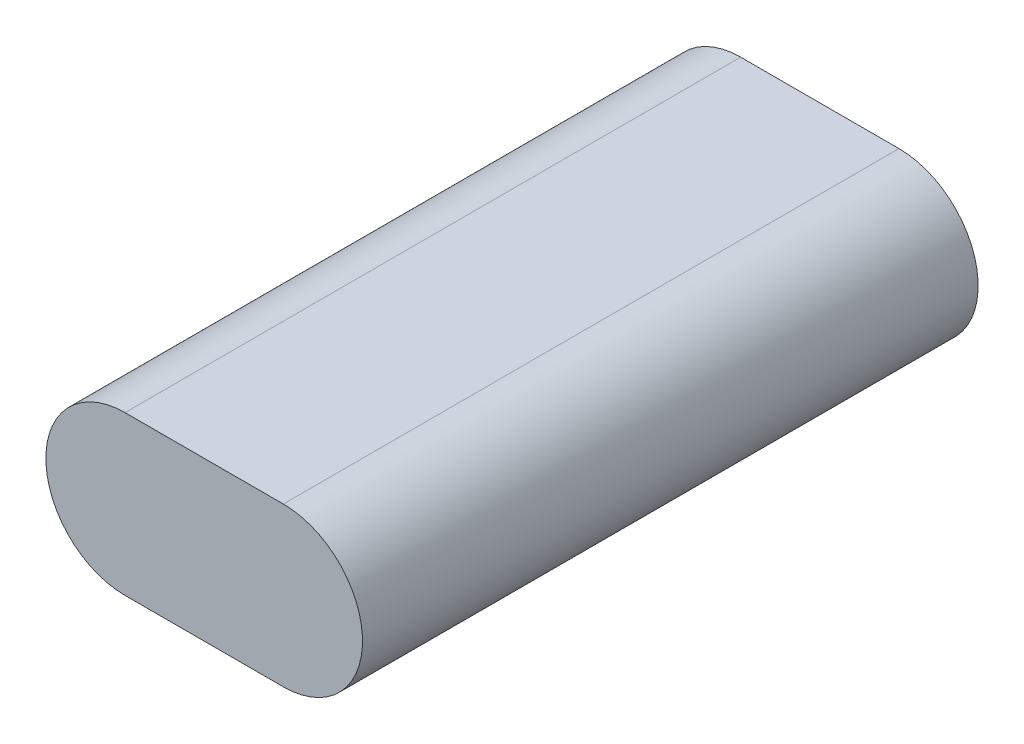
ISO-10303-21;
HEADER;
FILE_DESCRIPTION(('STEP AP214'),'2;1');
FILE_NAME('part.step','',(''),(''),'','','');
FILE_SCHEMA(('AUTOMOTIVE_DESIGN { 1 0 10303 214 1 1 1 1 }'));
ENDSEC;
DATA;
#1=APPLICATION_CONTEXT('core data for automotive mechanical design processes');
#2=APPLICATION_PROTOCOL_DEFINITION('international standard','automotive_design',2000,#1);
#3=PRODUCT_CONTEXT('',#1,'mechanical');
#4=PRODUCT('Part','Part','',(#3));
#5=PRODUCT_RELATED_PRODUCT_CATEGORY('part','',(#4));
#6=PRODUCT_DEFINITION_FORMATION('','',#4);
#7=PRODUCT_DEFINITION_CONTEXT('part definition',#1,'design');
#8=PRODUCT_DEFINITION('design','',#6,#7);
#9=PRODUCT_DEFINITION_SHAPE('','',#8);
#10=(LENGTH_UNIT() NAMED_UNIT(*) SI_UNIT(.MILLI.,.METRE.));
#11=(NAMED_UNIT(*) PLANE_ANGLE_UNIT() SI_UNIT($,.RADIAN.));
#12=(NAMED_UNIT(*) SI_UNIT($,.STERADIAN.) SOLID_ANGLE_UNIT());
#13=UNCERTAINTY_MEASURE_WITH_UNIT(LENGTH_MEASURE(1.E-05),#10,'distance_accuracy_value','');
#14=(GEOMETRIC_REPRESENTATION_CONTEXT(3) GLOBAL_UNCERTAINTY_ASSIGNED_CONTEXT((#13)) GLOBAL_UNIT_ASSIGNED_CONTEXT((#10,
#11,#12)) REPRESENTATION_CONTEXT('',''));
#15=CARTESIAN_POINT('',(0.,0.,0.));
#16=DIRECTION('',(0.,0.,1.));
#17=DIRECTION('',(1.,0.,0.));
#18=AXIS2_PLACEMENT_3D('',#15,#16,#17);
#19=CARTESIAN_POINT('',(-9.,0.,70.));
#20=DIRECTION('',(0.,0.,-1.));
#21=DIRECTION('',(-1.,0.,0.));
#22=AXIS2_PLACEMENT_3D('',#19,#20,#21);
#23=CYLINDRICAL_SURFACE('',#22,9.);
#24=CARTESIAN_POINT('',(-9.,0.,0.));
#25=DIRECTION('',(0.,0.,1.));
#26=DIRECTION('',(1.,0.,0.));
#27=AXIS2_PLACEMENT_3D('',#24,#25,#26);
#28=CIRCLE('',#27,9.);
#29=CARTESIAN_POINT('',(-9.,9.,0.));
#30=VERTEX_POINT('',#29);
#31=CARTESIAN_POINT('',(-9.,-9.,0.));
#32=VERTEX_POINT('',#31);
#33=EDGE_CURVE('E101',#30,#32,#28,.T.);
#34=ORIENTED_EDGE('',*,*,#33,.T.);
#35=DIRECTION('',(0.,0.,-1.));
#36=VECTOR('',#35,1.);
#37=CARTESIAN_POINT('',(-9.,-9.,70.));
#38=LINE('',#37,#36);
#39=CARTESIAN_POINT('',(-9.,-9.,70.));
#40=VERTEX_POINT('',#39);
#41=EDGE_CURVE('E11',#40,#32,#38,.T.);
#42=ORIENTED_EDGE('',*,*,#41,.F.);
#43=CARTESIAN_POINT('',(-9.,0.,70.));
#44=DIRECTION('',(0.,0.,1.));
#45=DIRECTION('',(1.,0.,0.));
#46=AXIS2_PLACEMENT_3D('',#43,#44,#45);
#47=CIRCLE('',#46,9.);
#48=CARTESIAN_POINT('',(-9.,9.,70.));
#49=VERTEX_POINT('',#48);
#50=EDGE_CURVE('E87',#49,#40,#47,.T.);
#51=ORIENTED_EDGE('',*,*,#50,.F.);
#52=DIRECTION('',(0.,0.,-1.));
#53=VECTOR('',#52,1.);
#54=CARTESIAN_POINT('',(-9.,9.,70.));
#55=LINE('',#54,#53);
#56=EDGE_CURVE('E54',#49,#30,#55,.T.);
#57=ORIENTED_EDGE('',*,*,#56,.T.);
#58=EDGE_LOOP('',(#34,#42,#51,#57));
#59=FACE_BOUND('',#58,.T.);
#60=ADVANCED_FACE('F38',(#59),#23,.T.);
#61=CARTESIAN_POINT('',(-9.,-9.,70.));
#62=DIRECTION('',(0.,1.,0.));
#63=DIRECTION('',(-1.,0.,0.));
#64=AXIS2_PLACEMENT_3D('',#61,#62,#63);
#65=PLANE('',#64);
#66=DIRECTION('',(1.,0.,0.));
#67=VECTOR('',#66,1.);
#68=CARTESIAN_POINT('',(-9.,-9.,0.));
#69=LINE('',#68,#67);
#70=CARTESIAN_POINT('',(9.,-9.,0.));
#71=VERTEX_POINT('',#70);
#72=EDGE_CURVE('E92',#32,#71,#69,.T.);
#73=ORIENTED_EDGE('',*,*,#72,.T.);
#74=DIRECTION('',(0.,0.,-1.));
#75=VECTOR('',#74,1.);
#76=CARTESIAN_POINT('',(9.,-9.,70.));
#77=LINE('',#76,#75);
#78=CARTESIAN_POINT('',(9.,-9.,70.));
#79=VERTEX_POINT('',#78);
#80=EDGE_CURVE('E46',#79,#71,#77,.T.);
#81=ORIENTED_EDGE('',*,*,#80,.F.);
#82=DIRECTION('',(1.,0.,0.));
#83=VECTOR('',#82,1.);
#84=CARTESIAN_POINT('',(-9.,-9.,70.));
#85=LINE('',#84,#83);
#86=EDGE_CURVE('E80',#40,#79,#85,.T.);
#87=ORIENTED_EDGE('',*,*,#86,.F.);
#88=ORIENTED_EDGE('',*,*,#41,.T.);
#89=EDGE_LOOP('',(#73,#81,#87,#88));
#90=FACE_BOUND('',#89,.T.);
#91=ADVANCED_FACE('F91',(#90),#65,.F.);
#92=CARTESIAN_POINT('',(9.,0.,70.));
#93=DIRECTION('',(0.,0.,-1.));
#94=DIRECTION('',(-1.,0.,0.));
#95=AXIS2_PLACEMENT_3D('',#92,#93,#94);
#96=CYLINDRICAL_SURFACE('',#95,9.);
#97=CARTESIAN_POINT('',(9.,0.,0.));
#98=DIRECTION('',(0.,0.,1.));
#99=DIRECTION('',(1.,0.,0.));
#100=AXIS2_PLACEMENT_3D('',#97,#98,#99);
#101=CIRCLE('',#100,9.);
#102=CARTESIAN_POINT('',(9.,9.,0.));
#103=VERTEX_POINT('',#102);
#104=EDGE_CURVE('E104',#71,#103,#101,.T.);
#105=ORIENTED_EDGE('',*,*,#104,.T.);
#106=DIRECTION('',(0.,0.,-1.));
#107=VECTOR('',#106,1.);
#108=CARTESIAN_POINT('',(9.,9.,70.));
#109=LINE('',#108,#107);
#110=CARTESIAN_POINT('',(9.,9.,70.));
#111=VERTEX_POINT('',#110);
#112=EDGE_CURVE('E69',#111,#103,#109,.T.);
#113=ORIENTED_EDGE('',*,*,#112,.F.);
#114=CARTESIAN_POINT('',(9.,0.,70.));
#115=DIRECTION('',(0.,0.,1.));
#116=DIRECTION('',(1.,0.,0.));
#117=AXIS2_PLACEMENT_3D('',#114,#115,#116);
#118=CIRCLE('',#117,9.);
#119=EDGE_CURVE('E86',#79,#111,#118,.T.);
#120=ORIENTED_EDGE('',*,*,#119,.F.);
#121=ORIENTED_EDGE('',*,*,#80,.T.);
#122=EDGE_LOOP('',(#105,#113,#120,#121));
#123=FACE_BOUND('',#122,.T.);
#124=ADVANCED_FACE('F95',(#123),#96,.T.);
#125=CARTESIAN_POINT('',(-9.,9.,70.));
#126=DIRECTION('',(0.,1.,0.));
#127=DIRECTION('',(-1.,0.,0.));
#128=AXIS2_PLACEMENT_3D('',#125,#126,#127);
#129=PLANE('',#128);
#130=DIRECTION('',(1.,0.,0.));
#131=VECTOR('',#130,1.);
#132=CARTESIAN_POINT('',(-9.,9.,0.));
#133=LINE('',#132,#131);
#134=EDGE_CURVE('E106',#30,#103,#133,.T.);
#135=ORIENTED_EDGE('',*,*,#134,.F.);
#136=ORIENTED_EDGE('',*,*,#56,.F.);
#137=DIRECTION('',(1.,0.,0.));
#138=VECTOR('',#137,1.);
#139=CARTESIAN_POINT('',(-9.,9.,70.));
#140=LINE('',#139,#138);
#141=EDGE_CURVE('E96',#49,#111,#140,.T.);
#142=ORIENTED_EDGE('',*,*,#141,.T.);
#143=ORIENTED_EDGE('',*,*,#112,.T.);
#144=EDGE_LOOP('',(#135,#136,#142,#143));
#145=FACE_BOUND('',#144,.T.);
#146=ADVANCED_FACE('F112',(#145),#129,.T.);
#147=CARTESIAN_POINT('',(-9.,0.,70.));
#148=DIRECTION('',(0.,0.,1.));
#149=DIRECTION('',(1.,0.,0.));
#150=AXIS2_PLACEMENT_3D('',#147,#148,#149);
#151=PLANE('',#150);
#152=ORIENTED_EDGE('',*,*,#50,.T.);
#153=ORIENTED_EDGE('',*,*,#86,.T.);
#154=ORIENTED_EDGE('',*,*,#119,.T.);
#155=ORIENTED_EDGE('',*,*,#141,.F.);
#156=EDGE_LOOP('',(#152,#153,#154,#155));
#157=FACE_BOUND('',#156,.T.);
#158=ADVANCED_FACE('F83',(#157),#151,.T.);
#159=CARTESIAN_POINT('',(-9.,0.,0.));
#160=DIRECTION('',(0.,0.,1.));
#161=DIRECTION('',(1.,0.,0.));
#162=AXIS2_PLACEMENT_3D('',#159,#160,#161);
#163=PLANE('',#162);
#164=ORIENTED_EDGE('',*,*,#33,.F.);
#165=ORIENTED_EDGE('',*,*,#134,.T.);
#166=ORIENTED_EDGE('',*,*,#104,.F.);
#167=ORIENTED_EDGE('',*,*,#72,.F.);
#168=EDGE_LOOP('',(#164,#165,#166,#167));
#169=FACE_BOUND('',#168,.T.);
#170=ADVANCED_FACE('F111',(#169),#163,.F.);
#171=CLOSED_SHELL('',(#60,#91,#124,#146,#158,#170));
#172=MANIFOLD_SOLID_BREP('B2',#171);
#173=ADVANCED_BREP_SHAPE_REPRESENTATION('',(#18,#172),#14);
#174=SHAPE_DEFINITION_REPRESENTATION(#9,#173);
ENDSEC;
END-ISO-10303-21;
